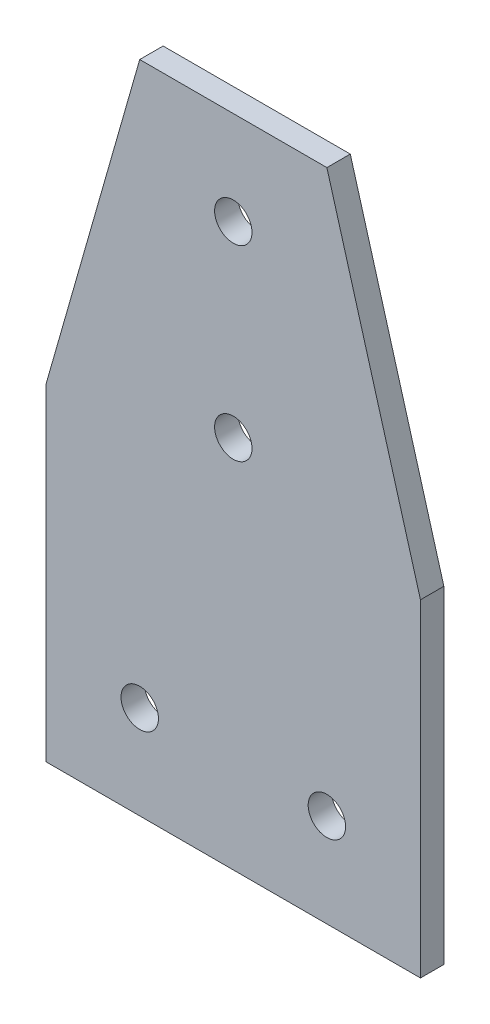
ISO-10303-21;
HEADER;
FILE_DESCRIPTION(('STEP AP214'),'2;1');
FILE_NAME('part.step','',(''),(''),'','','');
FILE_SCHEMA(('AUTOMOTIVE_DESIGN { 1 0 10303 214 1 1 1 1 }'));
ENDSEC;
DATA;
#1=APPLICATION_CONTEXT('core data for automotive mechanical design processes');
#2=APPLICATION_PROTOCOL_DEFINITION('international standard','automotive_design',2000,#1);
#3=PRODUCT_CONTEXT('',#1,'mechanical');
#4=PRODUCT('Part','Part','',(#3));
#5=PRODUCT_RELATED_PRODUCT_CATEGORY('part','',(#4));
#6=PRODUCT_DEFINITION_FORMATION('','',#4);
#7=PRODUCT_DEFINITION_CONTEXT('part definition',#1,'design');
#8=PRODUCT_DEFINITION('design','',#6,#7);
#9=PRODUCT_DEFINITION_SHAPE('','',#8);
#10=(LENGTH_UNIT() NAMED_UNIT(*) SI_UNIT(.MILLI.,.METRE.));
#11=(NAMED_UNIT(*) PLANE_ANGLE_UNIT() SI_UNIT($,.RADIAN.));
#12=(NAMED_UNIT(*) SI_UNIT($,.STERADIAN.) SOLID_ANGLE_UNIT());
#13=UNCERTAINTY_MEASURE_WITH_UNIT(LENGTH_MEASURE(1.E-05),#10,'distance_accuracy_value','');
#14=(GEOMETRIC_REPRESENTATION_CONTEXT(3) GLOBAL_UNCERTAINTY_ASSIGNED_CONTEXT((#13)) GLOBAL_UNIT_ASSIGNED_CONTEXT((#10,
#11,#12)) REPRESENTATION_CONTEXT('',''));
#15=CARTESIAN_POINT('',(0.,0.,0.));
#16=DIRECTION('',(0.,0.,1.));
#17=DIRECTION('',(1.,0.,0.));
#18=AXIS2_PLACEMENT_3D('',#15,#16,#17);
#19=CARTESIAN_POINT('',(0.,280.,10.));
#20=DIRECTION('',(0.,0.,-1.));
#21=DIRECTION('',(-1.,0.,0.));
#22=AXIS2_PLACEMENT_3D('',#19,#20,#21);
#23=PLANE('',#22);
#24=CARTESIAN_POINT('',(80.,240.,10.));
#25=DIRECTION('',(0.,0.,1.));
#26=DIRECTION('',(1.,0.,0.));
#27=AXIS2_PLACEMENT_3D('',#24,#25,#26);
#28=CIRCLE('',#27,8.);
#29=CARTESIAN_POINT('',(88.,240.,10.));
#30=VERTEX_POINT('',#29);
#31=EDGE_CURVE('E141',#30,#30,#28,.T.);
#32=ORIENTED_EDGE('',*,*,#31,.F.);
#33=EDGE_LOOP('',(#32));
#34=FACE_BOUND('',#33,.T.);
#35=CARTESIAN_POINT('',(80.,160.,10.));
#36=DIRECTION('',(0.,0.,1.));
#37=DIRECTION('',(1.,0.,0.));
#38=AXIS2_PLACEMENT_3D('',#35,#36,#37);
#39=CIRCLE('',#38,8.00000000000001);
#40=CARTESIAN_POINT('',(88.,160.,10.));
#41=VERTEX_POINT('',#40);
#42=EDGE_CURVE('E193',#41,#41,#39,.T.);
#43=ORIENTED_EDGE('',*,*,#42,.F.);
#44=EDGE_LOOP('',(#43));
#45=FACE_BOUND('',#44,.T.);
#46=CARTESIAN_POINT('',(40.,40.,10.));
#47=DIRECTION('',(0.,0.,1.));
#48=DIRECTION('',(1.,0.,0.));
#49=AXIS2_PLACEMENT_3D('',#46,#47,#48);
#50=CIRCLE('',#49,8.);
#51=CARTESIAN_POINT('',(48.,40.,10.));
#52=VERTEX_POINT('',#51);
#53=EDGE_CURVE('E197',#52,#52,#50,.T.);
#54=ORIENTED_EDGE('',*,*,#53,.F.);
#55=EDGE_LOOP('',(#54));
#56=FACE_BOUND('',#55,.T.);
#57=CARTESIAN_POINT('',(120.,40.,10.));
#58=DIRECTION('',(0.,0.,1.));
#59=DIRECTION('',(1.,0.,0.));
#60=AXIS2_PLACEMENT_3D('',#57,#58,#59);
#61=CIRCLE('',#60,8.00000000000001);
#62=CARTESIAN_POINT('',(128.,40.,10.));
#63=VERTEX_POINT('',#62);
#64=EDGE_CURVE('E200',#63,#63,#61,.T.);
#65=ORIENTED_EDGE('',*,*,#64,.F.);
#66=EDGE_LOOP('',(#65));
#67=FACE_BOUND('',#66,.T.);
#68=DIRECTION('',(0.,-1.,0.));
#69=VECTOR('',#68,1.);
#70=CARTESIAN_POINT('',(160.,280.,10.));
#71=LINE('',#70,#69);
#72=CARTESIAN_POINT('',(160.,140.,10.));
#73=VERTEX_POINT('',#72);
#74=CARTESIAN_POINT('',(160.,0.,10.));
#75=VERTEX_POINT('',#74);
#76=EDGE_CURVE('E108',#73,#75,#71,.T.);
#77=ORIENTED_EDGE('',*,*,#76,.F.);
#78=DIRECTION('',(0.274721127897378,-0.961523947640823,0.));
#79=VECTOR('',#78,1.);
#80=CARTESIAN_POINT('',(120.,280.,10.));
#81=LINE('',#80,#79);
#82=CARTESIAN_POINT('',(120.,280.,10.));
#83=VERTEX_POINT('',#82);
#84=EDGE_CURVE('E97',#83,#73,#81,.T.);
#85=ORIENTED_EDGE('',*,*,#84,.F.);
#86=DIRECTION('',(1.,0.,0.));
#87=VECTOR('',#86,1.);
#88=CARTESIAN_POINT('',(0.,280.,10.));
#89=LINE('',#88,#87);
#90=CARTESIAN_POINT('',(40.,280.,10.));
#91=VERTEX_POINT('',#90);
#92=EDGE_CURVE('E106',#91,#83,#89,.T.);
#93=ORIENTED_EDGE('',*,*,#92,.F.);
#94=DIRECTION('',(0.274721127897378,0.961523947640823,0.));
#95=VECTOR('',#94,1.);
#96=CARTESIAN_POINT('',(40.,280.,10.));
#97=LINE('',#96,#95);
#98=CARTESIAN_POINT('',(0.,140.,10.));
#99=VERTEX_POINT('',#98);
#100=EDGE_CURVE('E68',#99,#91,#97,.T.);
#101=ORIENTED_EDGE('',*,*,#100,.F.);
#102=DIRECTION('',(0.,-1.,0.));
#103=VECTOR('',#102,1.);
#104=CARTESIAN_POINT('',(0.,280.,10.));
#105=LINE('',#104,#103);
#106=CARTESIAN_POINT('',(0.,0.,10.));
#107=VERTEX_POINT('',#106);
#108=EDGE_CURVE('E115',#99,#107,#105,.T.);
#109=ORIENTED_EDGE('',*,*,#108,.T.);
#110=DIRECTION('',(1.,0.,0.));
#111=VECTOR('',#110,1.);
#112=CARTESIAN_POINT('',(0.,0.,10.));
#113=LINE('',#112,#111);
#114=EDGE_CURVE('E123',#107,#75,#113,.T.);
#115=ORIENTED_EDGE('',*,*,#114,.T.);
#116=EDGE_LOOP('',(#77,#85,#93,#101,#109,#115));
#117=FACE_BOUND('',#116,.T.);
#118=ADVANCED_FACE('F45',(#34,#45,#56,#67,#117),#23,.F.);
#119=CARTESIAN_POINT('',(160.,280.,0.));
#120=DIRECTION('',(1.,0.,0.));
#121=DIRECTION('',(0.,0.,-1.));
#122=AXIS2_PLACEMENT_3D('',#119,#120,#121);
#123=PLANE('',#122);
#124=DIRECTION('',(0.,0.,1.));
#125=VECTOR('',#124,1.);
#126=CARTESIAN_POINT('',(160.,140.,-5.));
#127=LINE('',#126,#125);
#128=CARTESIAN_POINT('',(160.,140.,0.));
#129=VERTEX_POINT('',#128);
#130=EDGE_CURVE('E109',#129,#73,#127,.T.);
#131=ORIENTED_EDGE('',*,*,#130,.T.);
#132=ORIENTED_EDGE('',*,*,#76,.T.);
#133=DIRECTION('',(0.,0.,1.));
#134=VECTOR('',#133,1.);
#135=CARTESIAN_POINT('',(160.,0.,0.));
#136=LINE('',#135,#134);
#137=CARTESIAN_POINT('',(160.,0.,0.));
#138=VERTEX_POINT('',#137);
#139=EDGE_CURVE('E125',#138,#75,#136,.T.);
#140=ORIENTED_EDGE('',*,*,#139,.F.);
#141=DIRECTION('',(0.,-1.,0.));
#142=VECTOR('',#141,1.);
#143=CARTESIAN_POINT('',(160.,280.,0.));
#144=LINE('',#143,#142);
#145=EDGE_CURVE('E133',#129,#138,#144,.T.);
#146=ORIENTED_EDGE('',*,*,#145,.F.);
#147=EDGE_LOOP('',(#131,#132,#140,#146));
#148=FACE_BOUND('',#147,.T.);
#149=ADVANCED_FACE('F159',(#148),#123,.T.);
#150=CARTESIAN_POINT('',(0.,280.,0.));
#151=DIRECTION('',(0.,0.,-1.));
#152=DIRECTION('',(-1.,0.,0.));
#153=AXIS2_PLACEMENT_3D('',#150,#151,#152);
#154=PLANE('',#153);
#155=CARTESIAN_POINT('',(80.,240.,0.));
#156=DIRECTION('',(0.,0.,-1.));
#157=DIRECTION('',(-1.,0.,0.));
#158=AXIS2_PLACEMENT_3D('',#155,#156,#157);
#159=CIRCLE('',#158,8.);
#160=CARTESIAN_POINT('',(72.,240.,0.));
#161=VERTEX_POINT('',#160);
#162=EDGE_CURVE('E48',#161,#161,#159,.T.);
#163=ORIENTED_EDGE('',*,*,#162,.F.);
#164=EDGE_LOOP('',(#163));
#165=FACE_BOUND('',#164,.T.);
#166=CARTESIAN_POINT('',(80.,160.,0.));
#167=DIRECTION('',(0.,0.,-1.));
#168=DIRECTION('',(-1.,0.,0.));
#169=AXIS2_PLACEMENT_3D('',#166,#167,#168);
#170=CIRCLE('',#169,8.00000000000001);
#171=CARTESIAN_POINT('',(72.,160.,0.));
#172=VERTEX_POINT('',#171);
#173=EDGE_CURVE('E143',#172,#172,#170,.T.);
#174=ORIENTED_EDGE('',*,*,#173,.F.);
#175=EDGE_LOOP('',(#174));
#176=FACE_BOUND('',#175,.T.);
#177=CARTESIAN_POINT('',(40.,40.,0.));
#178=DIRECTION('',(0.,0.,-1.));
#179=DIRECTION('',(-1.,0.,0.));
#180=AXIS2_PLACEMENT_3D('',#177,#178,#179);
#181=CIRCLE('',#180,8.);
#182=CARTESIAN_POINT('',(32.,40.,0.));
#183=VERTEX_POINT('',#182);
#184=EDGE_CURVE('E140',#183,#183,#181,.T.);
#185=ORIENTED_EDGE('',*,*,#184,.F.);
#186=EDGE_LOOP('',(#185));
#187=FACE_BOUND('',#186,.T.);
#188=CARTESIAN_POINT('',(120.,40.,0.));
#189=DIRECTION('',(0.,0.,-1.));
#190=DIRECTION('',(-1.,0.,0.));
#191=AXIS2_PLACEMENT_3D('',#188,#189,#190);
#192=CIRCLE('',#191,8.00000000000001);
#193=CARTESIAN_POINT('',(112.,40.,0.));
#194=VERTEX_POINT('',#193);
#195=EDGE_CURVE('E137',#194,#194,#192,.T.);
#196=ORIENTED_EDGE('',*,*,#195,.F.);
#197=EDGE_LOOP('',(#196));
#198=FACE_BOUND('',#197,.T.);
#199=DIRECTION('',(-0.274721127897378,0.961523947640823,0.));
#200=VECTOR('',#199,1.);
#201=CARTESIAN_POINT('',(110.943396226415,311.698113207547,0.));
#202=LINE('',#201,#200);
#203=CARTESIAN_POINT('',(120.,280.,0.));
#204=VERTEX_POINT('',#203);
#205=EDGE_CURVE('E61',#129,#204,#202,.T.);
#206=ORIENTED_EDGE('',*,*,#205,.F.);
#207=ORIENTED_EDGE('',*,*,#145,.T.);
#208=DIRECTION('',(1.,0.,0.));
#209=VECTOR('',#208,1.);
#210=CARTESIAN_POINT('',(0.,0.,0.));
#211=LINE('',#210,#209);
#212=CARTESIAN_POINT('',(0.,0.,0.));
#213=VERTEX_POINT('',#212);
#214=EDGE_CURVE('E118',#213,#138,#211,.T.);
#215=ORIENTED_EDGE('',*,*,#214,.F.);
#216=DIRECTION('',(0.,-1.,0.));
#217=VECTOR('',#216,1.);
#218=CARTESIAN_POINT('',(0.,280.,0.));
#219=LINE('',#218,#217);
#220=CARTESIAN_POINT('',(0.,140.,0.));
#221=VERTEX_POINT('',#220);
#222=EDGE_CURVE('E131',#221,#213,#219,.T.);
#223=ORIENTED_EDGE('',*,*,#222,.F.);
#224=DIRECTION('',(-0.274721127897378,-0.961523947640823,0.));
#225=VECTOR('',#224,1.);
#226=CARTESIAN_POINT('',(36.9811320754717,269.433962264151,0.));
#227=LINE('',#226,#225);
#228=CARTESIAN_POINT('',(40.,280.,0.));
#229=VERTEX_POINT('',#228);
#230=EDGE_CURVE('E155',#229,#221,#227,.T.);
#231=ORIENTED_EDGE('',*,*,#230,.F.);
#232=DIRECTION('',(1.,0.,0.));
#233=VECTOR('',#232,1.);
#234=CARTESIAN_POINT('',(0.,280.,0.));
#235=LINE('',#234,#233);
#236=EDGE_CURVE('E112',#229,#204,#235,.T.);
#237=ORIENTED_EDGE('',*,*,#236,.T.);
#238=EDGE_LOOP('',(#206,#207,#215,#223,#231,#237));
#239=FACE_BOUND('',#238,.T.);
#240=ADVANCED_FACE('F162',(#165,#176,#187,#198,#239),#154,.T.);
#241=CARTESIAN_POINT('',(0.,280.,10.));
#242=DIRECTION('',(-1.,0.,0.));
#243=DIRECTION('',(0.,0.,1.));
#244=AXIS2_PLACEMENT_3D('',#241,#242,#243);
#245=PLANE('',#244);
#246=DIRECTION('',(0.,0.,1.));
#247=VECTOR('',#246,1.);
#248=CARTESIAN_POINT('',(0.,140.,-5.));
#249=LINE('',#248,#247);
#250=EDGE_CURVE('E148',#221,#99,#249,.T.);
#251=ORIENTED_EDGE('',*,*,#250,.F.);
#252=ORIENTED_EDGE('',*,*,#222,.T.);
#253=DIRECTION('',(0.,0.,-1.));
#254=VECTOR('',#253,1.);
#255=CARTESIAN_POINT('',(0.,0.,10.));
#256=LINE('',#255,#254);
#257=EDGE_CURVE('E113',#107,#213,#256,.T.);
#258=ORIENTED_EDGE('',*,*,#257,.F.);
#259=ORIENTED_EDGE('',*,*,#108,.F.);
#260=EDGE_LOOP('',(#251,#252,#258,#259));
#261=FACE_BOUND('',#260,.T.);
#262=ADVANCED_FACE('F167',(#261),#245,.T.);
#263=CARTESIAN_POINT('',(0.,280.,0.));
#264=DIRECTION('',(0.,-1.,0.));
#265=DIRECTION('',(-1.,0.,0.));
#266=AXIS2_PLACEMENT_3D('',#263,#264,#265);
#267=PLANE('',#266);
#268=ORIENTED_EDGE('',*,*,#92,.T.);
#269=DIRECTION('',(0.,0.,-1.));
#270=VECTOR('',#269,1.);
#271=CARTESIAN_POINT('',(120.,280.,0.));
#272=LINE('',#271,#270);
#273=EDGE_CURVE('E11',#83,#204,#272,.T.);
#274=ORIENTED_EDGE('',*,*,#273,.T.);
#275=ORIENTED_EDGE('',*,*,#236,.F.);
#276=DIRECTION('',(0.,0.,1.));
#277=VECTOR('',#276,1.);
#278=CARTESIAN_POINT('',(40.,280.,0.));
#279=LINE('',#278,#277);
#280=EDGE_CURVE('E53',#229,#91,#279,.T.);
#281=ORIENTED_EDGE('',*,*,#280,.T.);
#282=EDGE_LOOP('',(#268,#274,#275,#281));
#283=FACE_BOUND('',#282,.T.);
#284=ADVANCED_FACE('F111',(#283),#267,.F.);
#285=CARTESIAN_POINT('',(0.,0.,0.));
#286=DIRECTION('',(0.,-1.,0.));
#287=DIRECTION('',(-1.,0.,0.));
#288=AXIS2_PLACEMENT_3D('',#285,#286,#287);
#289=PLANE('',#288);
#290=ORIENTED_EDGE('',*,*,#114,.F.);
#291=ORIENTED_EDGE('',*,*,#257,.T.);
#292=ORIENTED_EDGE('',*,*,#214,.T.);
#293=ORIENTED_EDGE('',*,*,#139,.T.);
#294=EDGE_LOOP('',(#290,#291,#292,#293));
#295=FACE_BOUND('',#294,.T.);
#296=ADVANCED_FACE('F171',(#295),#289,.T.);
#297=CARTESIAN_POINT('',(40.,280.,-5.));
#298=DIRECTION('',(0.961523947640823,-0.274721127897378,0.));
#299=DIRECTION('',(0.274721127897378,0.961523947640823,0.));
#300=AXIS2_PLACEMENT_3D('',#297,#298,#299);
#301=PLANE('',#300);
#302=ORIENTED_EDGE('',*,*,#230,.T.);
#303=ORIENTED_EDGE('',*,*,#250,.T.);
#304=ORIENTED_EDGE('',*,*,#100,.T.);
#305=ORIENTED_EDGE('',*,*,#280,.F.);
#306=EDGE_LOOP('',(#302,#303,#304,#305));
#307=FACE_BOUND('',#306,.T.);
#308=ADVANCED_FACE('F173',(#307),#301,.F.);
#309=CARTESIAN_POINT('',(120.,280.,-5.));
#310=DIRECTION('',(-0.961523947640823,-0.274721127897378,0.));
#311=DIRECTION('',(0.274721127897378,-0.961523947640823,0.));
#312=AXIS2_PLACEMENT_3D('',#309,#310,#311);
#313=PLANE('',#312);
#314=ORIENTED_EDGE('',*,*,#205,.T.);
#315=ORIENTED_EDGE('',*,*,#273,.F.);
#316=ORIENTED_EDGE('',*,*,#84,.T.);
#317=ORIENTED_EDGE('',*,*,#130,.F.);
#318=EDGE_LOOP('',(#314,#315,#316,#317));
#319=FACE_BOUND('',#318,.T.);
#320=ADVANCED_FACE('F96',(#319),#313,.F.);
#321=CARTESIAN_POINT('',(120.,40.,-5.));
#322=DIRECTION('',(0.,0.,1.));
#323=DIRECTION('',(1.,0.,0.));
#324=AXIS2_PLACEMENT_3D('',#321,#322,#323);
#325=CYLINDRICAL_SURFACE('',#324,8.00000000000001);
#326=ORIENTED_EDGE('',*,*,#195,.T.);
#327=EDGE_LOOP('',(#326));
#328=FACE_BOUND('',#327,.T.);
#329=ORIENTED_EDGE('',*,*,#64,.T.);
#330=EDGE_LOOP('',(#329));
#331=FACE_BOUND('',#330,.T.);
#332=ADVANCED_FACE('F219',(#328,#331),#325,.F.);
#333=CARTESIAN_POINT('',(40.,40.,-5.));
#334=DIRECTION('',(0.,0.,1.));
#335=DIRECTION('',(1.,0.,0.));
#336=AXIS2_PLACEMENT_3D('',#333,#334,#335);
#337=CYLINDRICAL_SURFACE('',#336,8.);
#338=ORIENTED_EDGE('',*,*,#184,.T.);
#339=EDGE_LOOP('',(#338));
#340=FACE_BOUND('',#339,.T.);
#341=ORIENTED_EDGE('',*,*,#53,.T.);
#342=EDGE_LOOP('',(#341));
#343=FACE_BOUND('',#342,.T.);
#344=ADVANCED_FACE('F214',(#340,#343),#337,.F.);
#345=CARTESIAN_POINT('',(80.,160.,-5.));
#346=DIRECTION('',(0.,0.,1.));
#347=DIRECTION('',(1.,0.,0.));
#348=AXIS2_PLACEMENT_3D('',#345,#346,#347);
#349=CYLINDRICAL_SURFACE('',#348,8.00000000000001);
#350=ORIENTED_EDGE('',*,*,#173,.T.);
#351=EDGE_LOOP('',(#350));
#352=FACE_BOUND('',#351,.T.);
#353=ORIENTED_EDGE('',*,*,#42,.T.);
#354=EDGE_LOOP('',(#353));
#355=FACE_BOUND('',#354,.T.);
#356=ADVANCED_FACE('F209',(#352,#355),#349,.F.);
#357=CARTESIAN_POINT('',(80.,240.,-5.));
#358=DIRECTION('',(0.,0.,1.));
#359=DIRECTION('',(1.,0.,0.));
#360=AXIS2_PLACEMENT_3D('',#357,#358,#359);
#361=CYLINDRICAL_SURFACE('',#360,8.);
#362=ORIENTED_EDGE('',*,*,#162,.T.);
#363=EDGE_LOOP('',(#362));
#364=FACE_BOUND('',#363,.T.);
#365=ORIENTED_EDGE('',*,*,#31,.T.);
#366=EDGE_LOOP('',(#365));
#367=FACE_BOUND('',#366,.T.);
#368=ADVANCED_FACE('F207',(#364,#367),#361,.F.);
#369=CLOSED_SHELL('',(#118,#149,#240,#262,#284,#296,#308,#320,#332,#344,#356,#368));
#370=MANIFOLD_SOLID_BREP('B2',#369);
#371=ADVANCED_BREP_SHAPE_REPRESENTATION('',(#18,#370),#14);
#372=SHAPE_DEFINITION_REPRESENTATION(#9,#371);
ENDSEC;
END-ISO-10303-21;
